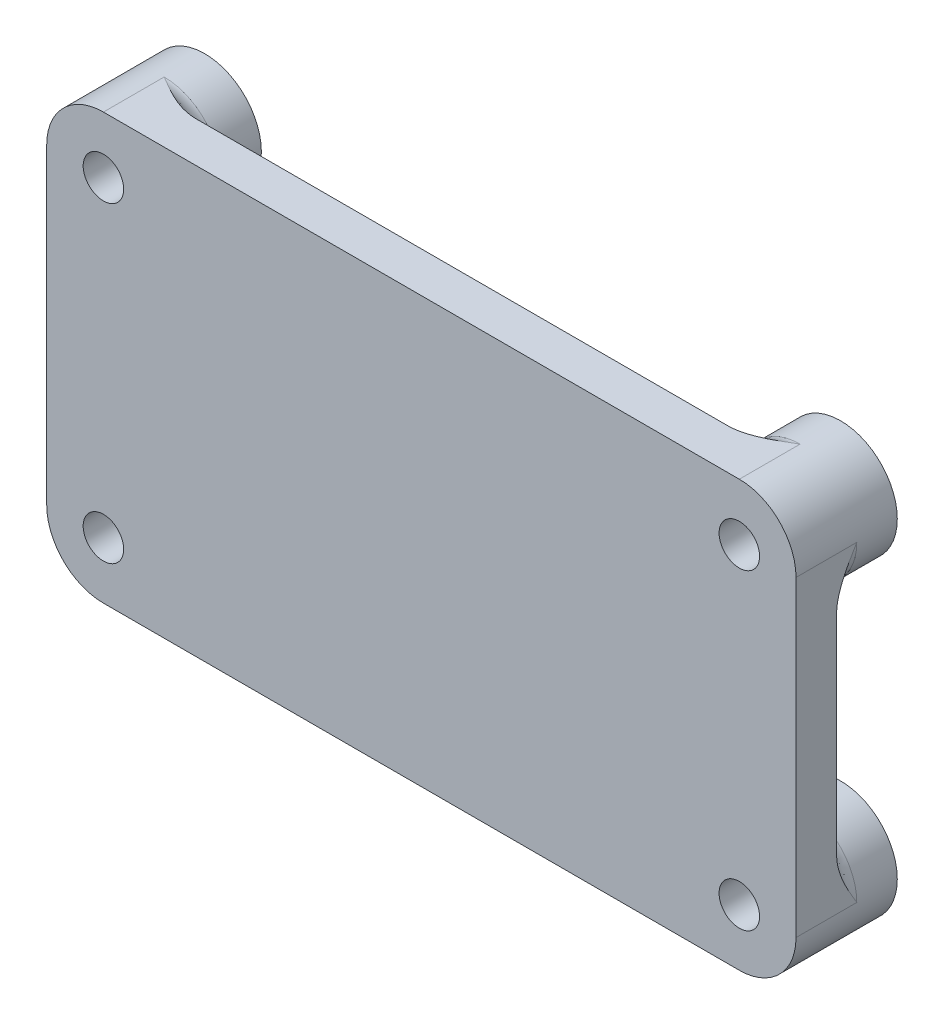
ISO-10303-21;
HEADER;
FILE_DESCRIPTION(('STEP AP214'),'2;1');
FILE_NAME('part.step','',(''),(''),'','','');
FILE_SCHEMA(('AUTOMOTIVE_DESIGN { 1 0 10303 214 1 1 1 1 }'));
ENDSEC;
DATA;
#1=APPLICATION_CONTEXT('core data for automotive mechanical design processes');
#2=APPLICATION_PROTOCOL_DEFINITION('international standard','automotive_design',2000,#1);
#3=PRODUCT_CONTEXT('',#1,'mechanical');
#4=PRODUCT('Part','Part','',(#3));
#5=PRODUCT_RELATED_PRODUCT_CATEGORY('part','',(#4));
#6=PRODUCT_DEFINITION_FORMATION('','',#4);
#7=PRODUCT_DEFINITION_CONTEXT('part definition',#1,'design');
#8=PRODUCT_DEFINITION('design','',#6,#7);
#9=PRODUCT_DEFINITION_SHAPE('','',#8);
#10=(LENGTH_UNIT() NAMED_UNIT(*) SI_UNIT(.MILLI.,.METRE.));
#11=(NAMED_UNIT(*) PLANE_ANGLE_UNIT() SI_UNIT($,.RADIAN.));
#12=(NAMED_UNIT(*) SI_UNIT($,.STERADIAN.) SOLID_ANGLE_UNIT());
#13=UNCERTAINTY_MEASURE_WITH_UNIT(LENGTH_MEASURE(1.E-05),#10,'distance_accuracy_value','');
#14=(GEOMETRIC_REPRESENTATION_CONTEXT(3) GLOBAL_UNCERTAINTY_ASSIGNED_CONTEXT((#13)) GLOBAL_UNIT_ASSIGNED_CONTEXT((#10,
#11,#12)) REPRESENTATION_CONTEXT('',''));
#15=CARTESIAN_POINT('',(0.,0.,0.));
#16=DIRECTION('',(0.,0.,1.));
#17=DIRECTION('',(1.,0.,0.));
#18=AXIS2_PLACEMENT_3D('',#15,#16,#17);
#19=CARTESIAN_POINT('',(0.,10.5,-2.));
#20=DIRECTION('',(0.,-1.,0.));
#21=DIRECTION('',(0.,0.,-1.));
#22=AXIS2_PLACEMENT_3D('',#19,#20,#21);
#23=PLANE('',#22);
#24=DIRECTION('',(1.,0.,0.));
#25=VECTOR('',#24,1.);
#26=CARTESIAN_POINT('',(0.,10.5,0.));
#27=LINE('',#26,#25);
#28=CARTESIAN_POINT('',(-15.7,10.5,0.));
#29=VERTEX_POINT('',#28);
#30=CARTESIAN_POINT('',(15.7,10.5,0.));
#31=VERTEX_POINT('',#30);
#32=EDGE_CURVE('E206',#29,#31,#27,.T.);
#33=ORIENTED_EDGE('',*,*,#32,.T.);
#34=DIRECTION('',(0.,0.,1.));
#35=VECTOR('',#34,1.);
#36=CARTESIAN_POINT('',(15.7,10.5,-2.));
#37=LINE('',#36,#35);
#38=CARTESIAN_POINT('',(15.7,10.5,-3.));
#39=VERTEX_POINT('',#38);
#40=EDGE_CURVE('E65',#39,#31,#37,.T.);
#41=ORIENTED_EDGE('',*,*,#40,.F.);
#42=CARTESIAN_POINT('',(13.130953484267,10.5,-2.));
#43=CARTESIAN_POINT('',(13.2033392447506,10.5,-2.00001618546836));
#44=CARTESIAN_POINT('',(13.2756286815455,10.5,-2.00358851348212));
#45=CARTESIAN_POINT('',(13.4194883975998,10.5,-2.01695300590156));
#46=CARTESIAN_POINT('',(13.4910598736869,10.5,-2.02673201179053));
#47=CARTESIAN_POINT('',(13.7022101236231,10.5,-2.06369339812264));
#48=CARTESIAN_POINT('',(13.8404404400351,10.5,-2.09855656102878));
#49=CARTESIAN_POINT('',(14.12831240532,10.5,-2.18848255328066));
#50=CARTESIAN_POINT('',(14.2773210222677,10.5,-2.24547373680599));
#51=CARTESIAN_POINT('',(14.5698067464413,10.5,-2.37236776192104));
#52=CARTESIAN_POINT('',(14.7132763000383,10.5,-2.44228753123555));
#53=CARTESIAN_POINT('',(15.1392546910789,10.5,-2.66496210023395));
#54=CARTESIAN_POINT('',(15.415232330661,10.5000000000001,-2.8298195356163));
#55=CARTESIAN_POINT('',(15.6939437574616,10.5,-2.99638072182871));
#56=CARTESIAN_POINT('',(15.696971890941,10.5,-2.99819037801799));
#57=CARTESIAN_POINT('',(15.7,10.5,-3.));
#58=B_SPLINE_CURVE_WITH_KNOTS('',3,(#42,#43,#44,#45,#46,#47,#48,#49,#50,#51,#52,#53,#54,#55,#56,
#57),.UNSPECIFIED.,.F.,.F.,(4,2,2,2,2,2,2,4),(0.,0.216924746796609,0.433391129766204,
0.859750227296942,1.33750425415609,1.81588830375774,2.77936074055136,2.78994374579578),.UNSPECIFIED.);
#59=CARTESIAN_POINT('',(13.130953484267,10.5,-2.));
#60=VERTEX_POINT('',#59);
#61=EDGE_CURVE('E11',#39,#60,#58,.F.);
#62=ORIENTED_EDGE('',*,*,#61,.T.);
#63=DIRECTION('',(1.,0.,0.));
#64=VECTOR('',#63,1.);
#65=CARTESIAN_POINT('',(0.,10.5,-2.));
#66=LINE('',#65,#64);
#67=CARTESIAN_POINT('',(-13.130953484267,10.5,-2.));
#68=VERTEX_POINT('',#67);
#69=EDGE_CURVE('E212',#68,#60,#66,.T.);
#70=ORIENTED_EDGE('',*,*,#69,.F.);
#71=CARTESIAN_POINT('',(-13.130953484267,10.5,-2.));
#72=CARTESIAN_POINT('',(-13.2033392447508,10.5,-2.00001618546836));
#73=CARTESIAN_POINT('',(-13.2756286815458,10.5,-2.00358851348213));
#74=CARTESIAN_POINT('',(-13.4194883976003,10.5,-2.01695300590163));
#75=CARTESIAN_POINT('',(-13.4910598736876,10.5,-2.02673201179064));
#76=CARTESIAN_POINT('',(-13.7022101236236,10.5,-2.06369339812277));
#77=CARTESIAN_POINT('',(-13.8404404400354,10.5,-2.09855656102882));
#78=CARTESIAN_POINT('',(-14.1283124053199,10.5,-2.18848255328069));
#79=CARTESIAN_POINT('',(-14.2773210222675,10.5,-2.24547373680615));
#80=CARTESIAN_POINT('',(-14.5698067464411,10.5,-2.37236776192073));
#81=CARTESIAN_POINT('',(-14.7132763000383,10.5,-2.44228753123465));
#82=CARTESIAN_POINT('',(-15.1392546910778,10.5,-2.66496210023522));
#83=CARTESIAN_POINT('',(-15.4152323306561,10.5000000000001,-2.82981953562417));
#84=CARTESIAN_POINT('',(-15.6939437574615,10.5,-2.99638072182889));
#85=CARTESIAN_POINT('',(-15.696971890941,10.5,-2.99819037801807));
#86=CARTESIAN_POINT('',(-15.7,10.5,-3.));
#87=B_SPLINE_CURVE_WITH_KNOTS('',3,(#71,#72,#73,#74,#75,#76,#77,#78,#79,#80,#81,#82,#83,#84,#85,
#86),.UNSPECIFIED.,.F.,.F.,(4,2,2,2,2,2,2,4),(0.,0.216924746797071,0.433391129767027,
0.85975022729694,1.33750425415596,1.8158883037572,2.77936074055137,2.78994374579578),.UNSPECIFIED.);
#88=CARTESIAN_POINT('',(-15.7,10.5,-3.));
#89=VERTEX_POINT('',#88);
#90=EDGE_CURVE('E281',#68,#89,#87,.T.);
#91=ORIENTED_EDGE('',*,*,#90,.T.);
#92=DIRECTION('',(0.,0.,1.));
#93=VECTOR('',#92,1.);
#94=CARTESIAN_POINT('',(-15.7,10.5,-2.));
#95=LINE('',#94,#93);
#96=EDGE_CURVE('E219',#89,#29,#95,.T.);
#97=ORIENTED_EDGE('',*,*,#96,.T.);
#98=EDGE_LOOP('',(#33,#41,#62,#70,#91,#97));
#99=FACE_BOUND('',#98,.T.);
#100=ADVANCED_FACE('F38',(#99),#23,.F.);
#101=CARTESIAN_POINT('',(18.5,0.,-2.));
#102=DIRECTION('',(-1.,0.,0.));
#103=DIRECTION('',(0.,0.,1.));
#104=AXIS2_PLACEMENT_3D('',#101,#102,#103);
#105=PLANE('',#104);
#106=DIRECTION('',(0.,-1.,0.));
#107=VECTOR('',#106,1.);
#108=CARTESIAN_POINT('',(18.5,0.,0.));
#109=LINE('',#108,#107);
#110=CARTESIAN_POINT('',(18.5,7.7,0.));
#111=VERTEX_POINT('',#110);
#112=CARTESIAN_POINT('',(18.5,-7.7,0.));
#113=VERTEX_POINT('',#112);
#114=EDGE_CURVE('E216',#111,#113,#109,.T.);
#115=ORIENTED_EDGE('',*,*,#114,.T.);
#116=DIRECTION('',(0.,0.,1.));
#117=VECTOR('',#116,1.);
#118=CARTESIAN_POINT('',(18.5,-7.7,-2.));
#119=LINE('',#118,#117);
#120=CARTESIAN_POINT('',(18.5,-7.7,-3.));
#121=VERTEX_POINT('',#120);
#122=EDGE_CURVE('E224',#121,#113,#119,.T.);
#123=ORIENTED_EDGE('',*,*,#122,.F.);
#124=CARTESIAN_POINT('',(18.5,-5.13095348426697,-2.));
#125=CARTESIAN_POINT('',(18.5,-5.20333924475109,-2.00001618546835));
#126=CARTESIAN_POINT('',(18.5,-5.27562868154643,-2.00358851348216));
#127=CARTESIAN_POINT('',(18.5,-5.41948839760155,-2.01695300590178));
#128=CARTESIAN_POINT('',(18.5,-5.49105987368908,-2.02673201179086));
#129=CARTESIAN_POINT('',(18.5,-5.70221012362476,-2.06369339812304));
#130=CARTESIAN_POINT('',(18.5,-5.840440440036,-2.0985565610289));
#131=CARTESIAN_POINT('',(18.5,-6.12831240531974,-2.18848255328077));
#132=CARTESIAN_POINT('',(18.5,-6.27732102226707,-2.24547373680648));
#133=CARTESIAN_POINT('',(18.5,-6.56980674644084,-2.37236776192009));
#134=CARTESIAN_POINT('',(18.5,-6.71327630003846,-2.44228753123275));
#135=CARTESIAN_POINT('',(18.5,-7.13925469107526,-2.66496210023788));
#136=CARTESIAN_POINT('',(18.5,-7.41523233064574,-2.82981953564077));
#137=CARTESIAN_POINT('',(18.5,-7.69394375746128,-2.99638072182925));
#138=CARTESIAN_POINT('',(18.5,-7.69697189094087,-2.99819037801826));
#139=CARTESIAN_POINT('',(18.5,-7.7,-3.));
#140=B_SPLINE_CURVE_WITH_KNOTS('',3,(#124,#125,#126,#127,#128,#129,#130,#131,#132,#133,#134,
#135,#136,#137,#138,#139),.UNSPECIFIED.,.F.,.F.,(4,2,2,2,2,2,2,4),(0.,0.21692474679805,
0.433391129768769,0.859750227296941,1.33750425415567,1.81588830375606,2.77936074055135,
2.78994374579577),.UNSPECIFIED.);
#141=CARTESIAN_POINT('',(18.5,-5.13095348426697,-2.));
#142=VERTEX_POINT('',#141);
#143=EDGE_CURVE('E303',#121,#142,#140,.F.);
#144=ORIENTED_EDGE('',*,*,#143,.T.);
#145=DIRECTION('',(0.,-1.,0.));
#146=VECTOR('',#145,1.);
#147=CARTESIAN_POINT('',(18.5,0.,-2.));
#148=LINE('',#147,#146);
#149=CARTESIAN_POINT('',(18.5,5.13095348426697,-2.));
#150=VERTEX_POINT('',#149);
#151=EDGE_CURVE('E209',#150,#142,#148,.T.);
#152=ORIENTED_EDGE('',*,*,#151,.F.);
#153=CARTESIAN_POINT('',(18.5,5.13095348426697,-2.));
#154=CARTESIAN_POINT('',(18.5,5.20333924475109,-2.00001618546835));
#155=CARTESIAN_POINT('',(18.5,5.27562868154643,-2.00358851348216));
#156=CARTESIAN_POINT('',(18.5,5.41948839760155,-2.01695300590178));
#157=CARTESIAN_POINT('',(18.5,5.49105987368907,-2.02673201179086));
#158=CARTESIAN_POINT('',(18.5,5.70221012362476,-2.06369339812304));
#159=CARTESIAN_POINT('',(18.5,5.84044044003599,-2.0985565610289));
#160=CARTESIAN_POINT('',(18.5,6.12831240531974,-2.18848255328077));
#161=CARTESIAN_POINT('',(18.5,6.27732102226707,-2.24547373680648));
#162=CARTESIAN_POINT('',(18.5,6.56980674644084,-2.37236776192009));
#163=CARTESIAN_POINT('',(18.5,6.71327630003845,-2.44228753123275));
#164=CARTESIAN_POINT('',(18.5,7.13925469107526,-2.66496210023788));
#165=CARTESIAN_POINT('',(18.5,7.41523233064574,-2.82981953564077));
#166=CARTESIAN_POINT('',(18.5,7.69394375746127,-2.99638072182925));
#167=CARTESIAN_POINT('',(18.5,7.69697189094087,-2.99819037801826));
#168=CARTESIAN_POINT('',(18.5,7.7,-3.));
#169=B_SPLINE_CURVE_WITH_KNOTS('',3,(#153,#154,#155,#156,#157,#158,#159,#160,#161,#162,#163,
#164,#165,#166,#167,#168),.UNSPECIFIED.,.F.,.F.,(4,2,2,2,2,2,2,4),(0.,0.21692474679805,
0.433391129768769,0.859750227296941,1.33750425415567,1.81588830375606,2.77936074055135,
2.78994374579577),.UNSPECIFIED.);
#170=CARTESIAN_POINT('',(18.5,7.7,-3.));
#171=VERTEX_POINT('',#170);
#172=EDGE_CURVE('E51',#150,#171,#169,.T.);
#173=ORIENTED_EDGE('',*,*,#172,.T.);
#174=DIRECTION('',(0.,0.,1.));
#175=VECTOR('',#174,1.);
#176=CARTESIAN_POINT('',(18.5,7.7,-2.));
#177=LINE('',#176,#175);
#178=EDGE_CURVE('E58',#171,#111,#177,.T.);
#179=ORIENTED_EDGE('',*,*,#178,.T.);
#180=EDGE_LOOP('',(#115,#123,#144,#152,#173,#179));
#181=FACE_BOUND('',#180,.T.);
#182=ADVANCED_FACE('F307',(#181),#105,.F.);
#183=CARTESIAN_POINT('',(0.,-10.5,-2.));
#184=DIRECTION('',(0.,-1.,0.));
#185=DIRECTION('',(1.,0.,0.));
#186=AXIS2_PLACEMENT_3D('',#183,#184,#185);
#187=PLANE('',#186);
#188=DIRECTION('',(1.,0.,0.));
#189=VECTOR('',#188,1.);
#190=CARTESIAN_POINT('',(0.,-10.5,0.));
#191=LINE('',#190,#189);
#192=CARTESIAN_POINT('',(-15.7,-10.5,0.));
#193=VERTEX_POINT('',#192);
#194=CARTESIAN_POINT('',(15.7,-10.5,0.));
#195=VERTEX_POINT('',#194);
#196=EDGE_CURVE('E143',#193,#195,#191,.T.);
#197=ORIENTED_EDGE('',*,*,#196,.F.);
#198=DIRECTION('',(0.,0.,1.));
#199=VECTOR('',#198,1.);
#200=CARTESIAN_POINT('',(-15.7,-10.5,-2.));
#201=LINE('',#200,#199);
#202=CARTESIAN_POINT('',(-15.7,-10.5,-3.));
#203=VERTEX_POINT('',#202);
#204=EDGE_CURVE('E154',#203,#193,#201,.T.);
#205=ORIENTED_EDGE('',*,*,#204,.F.);
#206=CARTESIAN_POINT('',(-13.130953484267,-10.5,-2.));
#207=CARTESIAN_POINT('',(-13.2033392447509,-10.5,-2.00001618546835));
#208=CARTESIAN_POINT('',(-13.2756286815461,-10.5,-2.00358851348214));
#209=CARTESIAN_POINT('',(-13.4194883976009,-10.5,-2.0169530059017));
#210=CARTESIAN_POINT('',(-13.4910598736883,-10.5,-2.02673201179075));
#211=CARTESIAN_POINT('',(-13.7022101236242,-10.5,-2.0636933981229));
#212=CARTESIAN_POINT('',(-13.8404404400357,-10.5,-2.09855656102886));
#213=CARTESIAN_POINT('',(-14.1283124053198,-10.5,-2.18848255328073));
#214=CARTESIAN_POINT('',(-14.2773210222673,-10.5,-2.24547373680631));
#215=CARTESIAN_POINT('',(-14.569806746441,-10.5,-2.37236776192043));
#216=CARTESIAN_POINT('',(-14.7132763000384,-10.5,-2.44228753123373));
#217=CARTESIAN_POINT('',(-15.1392546910766,-10.5,-2.66496210023651));
#218=CARTESIAN_POINT('',(-15.4152323306511,-10.5,-2.82981953563221));
#219=CARTESIAN_POINT('',(-15.6939437574614,-10.5,-2.99638072182907));
#220=CARTESIAN_POINT('',(-15.6969718909409,-10.5,-2.99819037801817));
#221=CARTESIAN_POINT('',(-15.7,-10.5,-3.));
#222=B_SPLINE_CURVE_WITH_KNOTS('',3,(#206,#207,#208,#209,#210,#211,#212,#213,#214,#215,#216,
#217,#218,#219,#220,#221),.UNSPECIFIED.,.F.,.F.,(4,2,2,2,2,2,2,4),(0.,0.216924746797547,
0.433391129767872,0.859750227296941,1.33750425415583,1.81588830375666,2.77936074055137,
2.78994374579577),.UNSPECIFIED.);
#223=CARTESIAN_POINT('',(-13.130953484267,-10.5,-2.));
#224=VERTEX_POINT('',#223);
#225=EDGE_CURVE('E259',#203,#224,#222,.F.);
#226=ORIENTED_EDGE('',*,*,#225,.T.);
#227=DIRECTION('',(1.,0.,0.));
#228=VECTOR('',#227,1.);
#229=CARTESIAN_POINT('',(0.,-10.5,-2.));
#230=LINE('',#229,#228);
#231=CARTESIAN_POINT('',(13.130953484267,-10.5,-2.));
#232=VERTEX_POINT('',#231);
#233=EDGE_CURVE('E205',#224,#232,#230,.T.);
#234=ORIENTED_EDGE('',*,*,#233,.T.);
#235=CARTESIAN_POINT('',(13.130953484267,-10.5,-2.));
#236=CARTESIAN_POINT('',(13.2033392447511,-10.5,-2.00001618546835));
#237=CARTESIAN_POINT('',(13.2756286815464,-10.5,-2.00358851348216));
#238=CARTESIAN_POINT('',(13.4194883976014,-10.5,-2.01695300590176));
#239=CARTESIAN_POINT('',(13.4910598736889,-10.5,-2.02673201179084));
#240=CARTESIAN_POINT('',(13.7022101236246,-10.5,-2.06369339812301));
#241=CARTESIAN_POINT('',(13.8404404400359,-10.5,-2.09855656102889));
#242=CARTESIAN_POINT('',(14.1283124053198,-10.5,-2.18848255328076));
#243=CARTESIAN_POINT('',(14.2773210222671,-10.5,-2.24547373680645));
#244=CARTESIAN_POINT('',(14.5698067464409,-10.5,-2.37236776192016));
#245=CARTESIAN_POINT('',(14.7132763000384,-10.5,-2.44228753123293));
#246=CARTESIAN_POINT('',(15.1392546910755,-10.5,-2.66496210023764));
#247=CARTESIAN_POINT('',(15.4152323306467,-10.4999999999999,-2.82981953563921));
#248=CARTESIAN_POINT('',(15.6939437574613,-10.5,-2.99638072182923));
#249=CARTESIAN_POINT('',(15.6969718909409,-10.5,-2.99819037801824));
#250=CARTESIAN_POINT('',(15.7,-10.5,-3.));
#251=B_SPLINE_CURVE_WITH_KNOTS('',3,(#235,#236,#237,#238,#239,#240,#241,#242,#243,#244,#245,
#246,#247,#248,#249,#250),.UNSPECIFIED.,.F.,.F.,(4,2,2,2,2,2,2,4),(0.,0.216924746797957,
0.433391129768604,0.85975022729694,1.3375042541557,1.81588830375617,2.77936074055137,
2.78994374579577),.UNSPECIFIED.);
#252=CARTESIAN_POINT('',(15.7,-10.5,-3.));
#253=VERTEX_POINT('',#252);
#254=EDGE_CURVE('E299',#232,#253,#251,.T.);
#255=ORIENTED_EDGE('',*,*,#254,.T.);
#256=DIRECTION('',(0.,0.,1.));
#257=VECTOR('',#256,1.);
#258=CARTESIAN_POINT('',(15.7,-10.5,-2.));
#259=LINE('',#258,#257);
#260=EDGE_CURVE('E227',#253,#195,#259,.T.);
#261=ORIENTED_EDGE('',*,*,#260,.T.);
#262=EDGE_LOOP('',(#197,#205,#226,#234,#255,#261));
#263=FACE_BOUND('',#262,.T.);
#264=ADVANCED_FACE('F271',(#263),#187,.T.);
#265=CARTESIAN_POINT('',(-18.5,0.,-2.));
#266=DIRECTION('',(-1.,0.,0.));
#267=DIRECTION('',(0.,0.,1.));
#268=AXIS2_PLACEMENT_3D('',#265,#266,#267);
#269=PLANE('',#268);
#270=DIRECTION('',(0.,-1.,0.));
#271=VECTOR('',#270,1.);
#272=CARTESIAN_POINT('',(-18.5,0.,0.));
#273=LINE('',#272,#271);
#274=CARTESIAN_POINT('',(-18.5,7.7,0.));
#275=VERTEX_POINT('',#274);
#276=CARTESIAN_POINT('',(-18.5,-7.7,0.));
#277=VERTEX_POINT('',#276);
#278=EDGE_CURVE('E132',#275,#277,#273,.T.);
#279=ORIENTED_EDGE('',*,*,#278,.F.);
#280=DIRECTION('',(0.,0.,1.));
#281=VECTOR('',#280,1.);
#282=CARTESIAN_POINT('',(-18.5,7.7,-2.));
#283=LINE('',#282,#281);
#284=CARTESIAN_POINT('',(-18.5,7.7,-3.));
#285=VERTEX_POINT('',#284);
#286=EDGE_CURVE('E155',#285,#275,#283,.T.);
#287=ORIENTED_EDGE('',*,*,#286,.F.);
#288=CARTESIAN_POINT('',(-18.5,5.13095348426697,-2.));
#289=CARTESIAN_POINT('',(-18.5,5.20333924475092,-2.00001618546835));
#290=CARTESIAN_POINT('',(-18.5,5.27562868154609,-2.00358851348214));
#291=CARTESIAN_POINT('',(-18.5,5.41948839760092,-2.0169530059017));
#292=CARTESIAN_POINT('',(-18.5,5.49105987368832,-2.02673201179075));
#293=CARTESIAN_POINT('',(-18.5,5.70221012362417,-2.0636933981229));
#294=CARTESIAN_POINT('',(-18.5,5.84044044003569,-2.09855656102886));
#295=CARTESIAN_POINT('',(-18.5,6.12831240531982,-2.18848255328073));
#296=CARTESIAN_POINT('',(-18.5,6.27732102226729,-2.24547373680631));
#297=CARTESIAN_POINT('',(-18.5,6.56980674644099,-2.37236776192042));
#298=CARTESIAN_POINT('',(-18.5,6.71327630003839,-2.44228753123373));
#299=CARTESIAN_POINT('',(-18.5,7.13925469107655,-2.66496210023652));
#300=CARTESIAN_POINT('',(-18.5,7.41523233065107,-2.82981953563226));
#301=CARTESIAN_POINT('',(-18.5,7.6939437574614,-2.99638072182907));
#302=CARTESIAN_POINT('',(-18.5,7.69697189094093,-2.99819037801817));
#303=CARTESIAN_POINT('',(-18.5,7.7,-3.));
#304=B_SPLINE_CURVE_WITH_KNOTS('',3,(#288,#289,#290,#291,#292,#293,#294,#295,#296,#297,#298,
#299,#300,#301,#302,#303),.UNSPECIFIED.,.F.,.F.,(4,2,2,2,2,2,2,4),(0.,0.216924746797547,
0.433391129767876,0.859750227296942,1.33750425415582,1.81588830375665,2.77936074055137,
2.78994374579577),.UNSPECIFIED.);
#305=CARTESIAN_POINT('',(-18.5,5.13095348426697,-2.));
#306=VERTEX_POINT('',#305);
#307=EDGE_CURVE('E276',#285,#306,#304,.F.);
#308=ORIENTED_EDGE('',*,*,#307,.T.);
#309=DIRECTION('',(0.,-1.,0.));
#310=VECTOR('',#309,1.);
#311=CARTESIAN_POINT('',(-18.5,0.,-2.));
#312=LINE('',#311,#310);
#313=CARTESIAN_POINT('',(-18.5,-5.13095348426698,-2.));
#314=VERTEX_POINT('',#313);
#315=EDGE_CURVE('E203',#306,#314,#312,.T.);
#316=ORIENTED_EDGE('',*,*,#315,.T.);
#317=CARTESIAN_POINT('',(-18.5,-5.13095348426698,-2.));
#318=CARTESIAN_POINT('',(-18.5,-5.20333924475092,-2.00001618546835));
#319=CARTESIAN_POINT('',(-18.5,-5.2756286815461,-2.00358851348214));
#320=CARTESIAN_POINT('',(-18.5,-5.41948839760093,-2.0169530059017));
#321=CARTESIAN_POINT('',(-18.5,-5.49105987368833,-2.02673201179075));
#322=CARTESIAN_POINT('',(-18.5,-5.70221012362418,-2.0636933981229));
#323=CARTESIAN_POINT('',(-18.5,-5.84044044003569,-2.09855656102886));
#324=CARTESIAN_POINT('',(-18.5,-6.12831240531982,-2.18848255328073));
#325=CARTESIAN_POINT('',(-18.5,-6.27732102226729,-2.24547373680631));
#326=CARTESIAN_POINT('',(-18.5,-6.56980674644099,-2.37236776192042));
#327=CARTESIAN_POINT('',(-18.5,-6.7132763000384,-2.44228753123373));
#328=CARTESIAN_POINT('',(-18.5,-7.13925469107655,-2.66496210023652));
#329=CARTESIAN_POINT('',(-18.5,-7.41523233065107,-2.82981953563226));
#330=CARTESIAN_POINT('',(-18.5,-7.6939437574614,-2.99638072182907));
#331=CARTESIAN_POINT('',(-18.5,-7.69697189094093,-2.99819037801817));
#332=CARTESIAN_POINT('',(-18.5,-7.7,-3.));
#333=B_SPLINE_CURVE_WITH_KNOTS('',3,(#317,#318,#319,#320,#321,#322,#323,#324,#325,#326,#327,
#328,#329,#330,#331,#332),.UNSPECIFIED.,.F.,.F.,(4,2,2,2,2,2,2,4),(0.,0.216924746797549,
0.433391129767876,0.859750227296942,1.33750425415582,1.81588830375665,2.77936074055137,
2.78994374579577),.UNSPECIFIED.);
#334=CARTESIAN_POINT('',(-18.5,-7.7,-3.));
#335=VERTEX_POINT('',#334);
#336=EDGE_CURVE('E150',#314,#335,#333,.T.);
#337=ORIENTED_EDGE('',*,*,#336,.T.);
#338=DIRECTION('',(0.,0.,1.));
#339=VECTOR('',#338,1.);
#340=CARTESIAN_POINT('',(-18.5,-7.7,-2.));
#341=LINE('',#340,#339);
#342=EDGE_CURVE('E147',#335,#277,#341,.T.);
#343=ORIENTED_EDGE('',*,*,#342,.T.);
#344=EDGE_LOOP('',(#279,#287,#308,#316,#337,#343));
#345=FACE_BOUND('',#344,.T.);
#346=ADVANCED_FACE('F148',(#345),#269,.T.);
#347=CARTESIAN_POINT('',(0.,0.,-2.));
#348=DIRECTION('',(0.,0.,1.));
#349=DIRECTION('',(1.,0.,0.));
#350=AXIS2_PLACEMENT_3D('',#347,#348,#349);
#351=PLANE('',#350);
#352=ORIENTED_EDGE('',*,*,#233,.F.);
#353=CARTESIAN_POINT('',(-15.7,-7.7,-2.));
#354=DIRECTION('',(0.,0.,1.));
#355=DIRECTION('',(1.,0.,0.));
#356=AXIS2_PLACEMENT_3D('',#353,#354,#355);
#357=CIRCLE('',#356,3.8);
#358=EDGE_CURVE('E240',#224,#314,#357,.T.);
#359=ORIENTED_EDGE('',*,*,#358,.T.);
#360=ORIENTED_EDGE('',*,*,#315,.F.);
#361=CARTESIAN_POINT('',(-15.7,7.7,-2.));
#362=DIRECTION('',(0.,0.,1.));
#363=DIRECTION('',(1.,0.,0.));
#364=AXIS2_PLACEMENT_3D('',#361,#362,#363);
#365=CIRCLE('',#364,3.8);
#366=EDGE_CURVE('E234',#306,#68,#365,.T.);
#367=ORIENTED_EDGE('',*,*,#366,.T.);
#368=ORIENTED_EDGE('',*,*,#69,.T.);
#369=CARTESIAN_POINT('',(15.7,7.7,-2.));
#370=DIRECTION('',(0.,0.,1.));
#371=DIRECTION('',(1.,0.,0.));
#372=AXIS2_PLACEMENT_3D('',#369,#370,#371);
#373=CIRCLE('',#372,3.8);
#374=EDGE_CURVE('E221',#60,#150,#373,.T.);
#375=ORIENTED_EDGE('',*,*,#374,.T.);
#376=ORIENTED_EDGE('',*,*,#151,.T.);
#377=CARTESIAN_POINT('',(15.7,-7.7,-2.));
#378=DIRECTION('',(0.,0.,1.));
#379=DIRECTION('',(1.,0.,0.));
#380=AXIS2_PLACEMENT_3D('',#377,#378,#379);
#381=CIRCLE('',#380,3.8);
#382=EDGE_CURVE('E237',#142,#232,#381,.T.);
#383=ORIENTED_EDGE('',*,*,#382,.T.);
#384=EDGE_LOOP('',(#352,#359,#360,#367,#368,#375,#376,#383));
#385=FACE_BOUND('',#384,.T.);
#386=ADVANCED_FACE('F270',(#385),#351,.F.);
#387=CARTESIAN_POINT('',(0.,0.,0.));
#388=DIRECTION('',(0.,0.,1.));
#389=DIRECTION('',(1.,0.,0.));
#390=AXIS2_PLACEMENT_3D('',#387,#388,#389);
#391=PLANE('',#390);
#392=ORIENTED_EDGE('',*,*,#32,.F.);
#393=CARTESIAN_POINT('',(-15.7,7.7,0.));
#394=DIRECTION('',(0.,0.,1.));
#395=DIRECTION('',(1.,0.,0.));
#396=AXIS2_PLACEMENT_3D('',#393,#394,#395);
#397=CIRCLE('',#396,2.8);
#398=EDGE_CURVE('E140',#29,#275,#397,.T.);
#399=ORIENTED_EDGE('',*,*,#398,.T.);
#400=ORIENTED_EDGE('',*,*,#278,.T.);
#401=CARTESIAN_POINT('',(-15.7,-7.7,0.));
#402=DIRECTION('',(0.,0.,1.));
#403=DIRECTION('',(1.,0.,0.));
#404=AXIS2_PLACEMENT_3D('',#401,#402,#403);
#405=CIRCLE('',#404,2.8);
#406=EDGE_CURVE('E138',#277,#193,#405,.T.);
#407=ORIENTED_EDGE('',*,*,#406,.T.);
#408=ORIENTED_EDGE('',*,*,#196,.T.);
#409=CARTESIAN_POINT('',(15.7,-7.7,0.));
#410=DIRECTION('',(0.,0.,1.));
#411=DIRECTION('',(1.,0.,0.));
#412=AXIS2_PLACEMENT_3D('',#409,#410,#411);
#413=CIRCLE('',#412,2.8);
#414=EDGE_CURVE('E174',#195,#113,#413,.T.);
#415=ORIENTED_EDGE('',*,*,#414,.T.);
#416=ORIENTED_EDGE('',*,*,#114,.F.);
#417=CARTESIAN_POINT('',(15.7,7.7,0.));
#418=DIRECTION('',(0.,0.,1.));
#419=DIRECTION('',(1.,0.,0.));
#420=AXIS2_PLACEMENT_3D('',#417,#418,#419);
#421=CIRCLE('',#420,2.8);
#422=EDGE_CURVE('E187',#111,#31,#421,.T.);
#423=ORIENTED_EDGE('',*,*,#422,.T.);
#424=EDGE_LOOP('',(#392,#399,#400,#407,#408,#415,#416,#423));
#425=FACE_BOUND('',#424,.T.);
#426=CARTESIAN_POINT('',(-15.7,7.7,0.));
#427=DIRECTION('',(0.,0.,1.));
#428=DIRECTION('',(1.,0.,0.));
#429=AXIS2_PLACEMENT_3D('',#426,#427,#428);
#430=CIRCLE('',#429,1.);
#431=CARTESIAN_POINT('',(-14.7,7.7,0.));
#432=VERTEX_POINT('',#431);
#433=EDGE_CURVE('E190',#432,#432,#430,.T.);
#434=ORIENTED_EDGE('',*,*,#433,.F.);
#435=EDGE_LOOP('',(#434));
#436=FACE_BOUND('',#435,.T.);
#437=CARTESIAN_POINT('',(15.7,7.7,0.));
#438=DIRECTION('',(0.,0.,1.));
#439=DIRECTION('',(1.,0.,0.));
#440=AXIS2_PLACEMENT_3D('',#437,#438,#439);
#441=CIRCLE('',#440,1.);
#442=CARTESIAN_POINT('',(16.7,7.7,0.));
#443=VERTEX_POINT('',#442);
#444=EDGE_CURVE('E177',#443,#443,#441,.T.);
#445=ORIENTED_EDGE('',*,*,#444,.F.);
#446=EDGE_LOOP('',(#445));
#447=FACE_BOUND('',#446,.T.);
#448=CARTESIAN_POINT('',(15.7,-7.7,0.));
#449=DIRECTION('',(0.,0.,1.));
#450=DIRECTION('',(1.,0.,0.));
#451=AXIS2_PLACEMENT_3D('',#448,#449,#450);
#452=CIRCLE('',#451,1.);
#453=CARTESIAN_POINT('',(16.7,-7.7,0.));
#454=VERTEX_POINT('',#453);
#455=EDGE_CURVE('E178',#454,#454,#452,.T.);
#456=ORIENTED_EDGE('',*,*,#455,.F.);
#457=EDGE_LOOP('',(#456));
#458=FACE_BOUND('',#457,.T.);
#459=CARTESIAN_POINT('',(-15.7,-7.7,0.));
#460=DIRECTION('',(0.,0.,1.));
#461=DIRECTION('',(1.,0.,0.));
#462=AXIS2_PLACEMENT_3D('',#459,#460,#461);
#463=CIRCLE('',#462,1.);
#464=CARTESIAN_POINT('',(-14.7,-7.7,0.));
#465=VERTEX_POINT('',#464);
#466=EDGE_CURVE('E161',#465,#465,#463,.T.);
#467=ORIENTED_EDGE('',*,*,#466,.F.);
#468=EDGE_LOOP('',(#467));
#469=FACE_BOUND('',#468,.T.);
#470=ADVANCED_FACE('F135',(#425,#436,#447,#458,#469),#391,.T.);
#471=CARTESIAN_POINT('',(-15.7,7.7,-5.));
#472=DIRECTION('',(0.,0.,1.));
#473=DIRECTION('',(1.,0.,0.));
#474=AXIS2_PLACEMENT_3D('',#471,#472,#473);
#475=CYLINDRICAL_SURFACE('',#474,2.8);
#476=CARTESIAN_POINT('',(-15.7,7.7,-5.));
#477=DIRECTION('',(0.,0.,1.));
#478=DIRECTION('',(1.,0.,0.));
#479=AXIS2_PLACEMENT_3D('',#476,#477,#478);
#480=CIRCLE('',#479,2.8);
#481=CARTESIAN_POINT('',(-12.9,7.7,-5.));
#482=VERTEX_POINT('',#481);
#483=EDGE_CURVE('E144',#482,#482,#480,.T.);
#484=ORIENTED_EDGE('',*,*,#483,.T.);
#485=EDGE_LOOP('',(#484));
#486=FACE_BOUND('',#485,.T.);
#487=ORIENTED_EDGE('',*,*,#96,.F.);
#488=CARTESIAN_POINT('',(-15.7,7.7,-3.));
#489=DIRECTION('',(0.,0.,1.));
#490=DIRECTION('',(1.,0.,0.));
#491=AXIS2_PLACEMENT_3D('',#488,#489,#490);
#492=CIRCLE('',#491,2.8);
#493=EDGE_CURVE('E248',#89,#285,#492,.F.);
#494=ORIENTED_EDGE('',*,*,#493,.T.);
#495=ORIENTED_EDGE('',*,*,#286,.T.);
#496=ORIENTED_EDGE('',*,*,#398,.F.);
#497=EDGE_LOOP('',(#487,#494,#495,#496));
#498=FACE_BOUND('',#497,.T.);
#499=ADVANCED_FACE('F318',(#486,#498),#475,.T.);
#500=CARTESIAN_POINT('',(-15.7,7.7,-5.));
#501=DIRECTION('',(0.,0.,1.));
#502=DIRECTION('',(1.,0.,0.));
#503=AXIS2_PLACEMENT_3D('',#500,#501,#502);
#504=CYLINDRICAL_SURFACE('',#503,1.);
#505=CARTESIAN_POINT('',(-15.7,7.7,-5.));
#506=DIRECTION('',(0.,0.,1.));
#507=DIRECTION('',(1.,0.,0.));
#508=AXIS2_PLACEMENT_3D('',#505,#506,#507);
#509=CIRCLE('',#508,1.);
#510=CARTESIAN_POINT('',(-14.7,7.7,-5.));
#511=VERTEX_POINT('',#510);
#512=EDGE_CURVE('E195',#511,#511,#509,.T.);
#513=ORIENTED_EDGE('',*,*,#512,.F.);
#514=EDGE_LOOP('',(#513));
#515=FACE_BOUND('',#514,.T.);
#516=ORIENTED_EDGE('',*,*,#433,.T.);
#517=EDGE_LOOP('',(#516));
#518=FACE_BOUND('',#517,.T.);
#519=ADVANCED_FACE('F322',(#515,#518),#504,.F.);
#520=CARTESIAN_POINT('',(0.,0.,-5.));
#521=DIRECTION('',(0.,0.,1.));
#522=DIRECTION('',(1.,0.,0.));
#523=AXIS2_PLACEMENT_3D('',#520,#521,#522);
#524=PLANE('',#523);
#525=ORIENTED_EDGE('',*,*,#512,.T.);
#526=EDGE_LOOP('',(#525));
#527=FACE_BOUND('',#526,.T.);
#528=ORIENTED_EDGE('',*,*,#483,.F.);
#529=EDGE_LOOP('',(#528));
#530=FACE_BOUND('',#529,.T.);
#531=ADVANCED_FACE('F325',(#527,#530),#524,.F.);
#532=CARTESIAN_POINT('',(15.7,7.7,-5.));
#533=DIRECTION('',(0.,0.,1.));
#534=DIRECTION('',(1.,0.,0.));
#535=AXIS2_PLACEMENT_3D('',#532,#533,#534);
#536=CYLINDRICAL_SURFACE('',#535,1.);
#537=CARTESIAN_POINT('',(15.7,7.7,-5.));
#538=DIRECTION('',(0.,0.,1.));
#539=DIRECTION('',(1.,0.,0.));
#540=AXIS2_PLACEMENT_3D('',#537,#538,#539);
#541=CIRCLE('',#540,1.);
#542=CARTESIAN_POINT('',(16.7,7.7,-5.));
#543=VERTEX_POINT('',#542);
#544=EDGE_CURVE('E183',#543,#543,#541,.T.);
#545=ORIENTED_EDGE('',*,*,#544,.F.);
#546=EDGE_LOOP('',(#545));
#547=FACE_BOUND('',#546,.T.);
#548=ORIENTED_EDGE('',*,*,#444,.T.);
#549=EDGE_LOOP('',(#548));
#550=FACE_BOUND('',#549,.T.);
#551=ADVANCED_FACE('F332',(#547,#550),#536,.F.);
#552=CARTESIAN_POINT('',(15.7,7.7,-5.));
#553=DIRECTION('',(0.,0.,1.));
#554=DIRECTION('',(1.,0.,0.));
#555=AXIS2_PLACEMENT_3D('',#552,#553,#554);
#556=CYLINDRICAL_SURFACE('',#555,2.8);
#557=ORIENTED_EDGE('',*,*,#178,.F.);
#558=CARTESIAN_POINT('',(15.7,7.7,-3.));
#559=DIRECTION('',(0.,0.,1.));
#560=DIRECTION('',(1.,0.,0.));
#561=AXIS2_PLACEMENT_3D('',#558,#559,#560);
#562=CIRCLE('',#561,2.8);
#563=EDGE_CURVE('E251',#171,#39,#562,.F.);
#564=ORIENTED_EDGE('',*,*,#563,.T.);
#565=ORIENTED_EDGE('',*,*,#40,.T.);
#566=ORIENTED_EDGE('',*,*,#422,.F.);
#567=EDGE_LOOP('',(#557,#564,#565,#566));
#568=FACE_BOUND('',#567,.T.);
#569=CARTESIAN_POINT('',(15.7,7.7,-5.));
#570=DIRECTION('',(0.,0.,1.));
#571=DIRECTION('',(1.,0.,0.));
#572=AXIS2_PLACEMENT_3D('',#569,#570,#571);
#573=CIRCLE('',#572,2.8);
#574=CARTESIAN_POINT('',(18.5,7.7,-5.));
#575=VERTEX_POINT('',#574);
#576=EDGE_CURVE('E186',#575,#575,#573,.T.);
#577=ORIENTED_EDGE('',*,*,#576,.T.);
#578=EDGE_LOOP('',(#577));
#579=FACE_BOUND('',#578,.T.);
#580=ADVANCED_FACE('F336',(#568,#579),#556,.T.);
#581=CARTESIAN_POINT('',(0.,0.,-5.));
#582=DIRECTION('',(0.,0.,1.));
#583=DIRECTION('',(1.,0.,0.));
#584=AXIS2_PLACEMENT_3D('',#581,#582,#583);
#585=PLANE('',#584);
#586=ORIENTED_EDGE('',*,*,#544,.T.);
#587=EDGE_LOOP('',(#586));
#588=FACE_BOUND('',#587,.T.);
#589=ORIENTED_EDGE('',*,*,#576,.F.);
#590=EDGE_LOOP('',(#589));
#591=FACE_BOUND('',#590,.T.);
#592=ADVANCED_FACE('F340',(#588,#591),#585,.F.);
#593=CARTESIAN_POINT('',(15.7,-7.7,-5.));
#594=DIRECTION('',(0.,0.,1.));
#595=DIRECTION('',(1.,0.,0.));
#596=AXIS2_PLACEMENT_3D('',#593,#594,#595);
#597=CYLINDRICAL_SURFACE('',#596,1.);
#598=CARTESIAN_POINT('',(15.7,-7.7,-5.));
#599=DIRECTION('',(0.,0.,1.));
#600=DIRECTION('',(1.,0.,0.));
#601=AXIS2_PLACEMENT_3D('',#598,#599,#600);
#602=CIRCLE('',#601,1.);
#603=CARTESIAN_POINT('',(16.7,-7.7,-5.));
#604=VERTEX_POINT('',#603);
#605=EDGE_CURVE('E170',#604,#604,#602,.T.);
#606=ORIENTED_EDGE('',*,*,#605,.F.);
#607=EDGE_LOOP('',(#606));
#608=FACE_BOUND('',#607,.T.);
#609=ORIENTED_EDGE('',*,*,#455,.T.);
#610=EDGE_LOOP('',(#609));
#611=FACE_BOUND('',#610,.T.);
#612=ADVANCED_FACE('F343',(#608,#611),#597,.F.);
#613=CARTESIAN_POINT('',(15.7,-7.7,-5.));
#614=DIRECTION('',(0.,0.,1.));
#615=DIRECTION('',(1.,0.,0.));
#616=AXIS2_PLACEMENT_3D('',#613,#614,#615);
#617=CYLINDRICAL_SURFACE('',#616,2.8);
#618=ORIENTED_EDGE('',*,*,#260,.F.);
#619=CARTESIAN_POINT('',(15.7,-7.7,-3.));
#620=DIRECTION('',(0.,0.,1.));
#621=DIRECTION('',(1.,0.,0.));
#622=AXIS2_PLACEMENT_3D('',#619,#620,#621);
#623=CIRCLE('',#622,2.8);
#624=EDGE_CURVE('E245',#253,#121,#623,.F.);
#625=ORIENTED_EDGE('',*,*,#624,.T.);
#626=ORIENTED_EDGE('',*,*,#122,.T.);
#627=ORIENTED_EDGE('',*,*,#414,.F.);
#628=EDGE_LOOP('',(#618,#625,#626,#627));
#629=FACE_BOUND('',#628,.T.);
#630=CARTESIAN_POINT('',(15.7,-7.7,-5.));
#631=DIRECTION('',(0.,0.,1.));
#632=DIRECTION('',(1.,0.,0.));
#633=AXIS2_PLACEMENT_3D('',#630,#631,#632);
#634=CIRCLE('',#633,2.8);
#635=CARTESIAN_POINT('',(18.5,-7.7,-5.));
#636=VERTEX_POINT('',#635);
#637=EDGE_CURVE('E173',#636,#636,#634,.T.);
#638=ORIENTED_EDGE('',*,*,#637,.T.);
#639=EDGE_LOOP('',(#638));
#640=FACE_BOUND('',#639,.T.);
#641=ADVANCED_FACE('F347',(#629,#640),#617,.T.);
#642=CARTESIAN_POINT('',(0.,0.,-5.));
#643=DIRECTION('',(0.,0.,1.));
#644=DIRECTION('',(1.,0.,0.));
#645=AXIS2_PLACEMENT_3D('',#642,#643,#644);
#646=PLANE('',#645);
#647=ORIENTED_EDGE('',*,*,#605,.T.);
#648=EDGE_LOOP('',(#647));
#649=FACE_BOUND('',#648,.T.);
#650=ORIENTED_EDGE('',*,*,#637,.F.);
#651=EDGE_LOOP('',(#650));
#652=FACE_BOUND('',#651,.T.);
#653=ADVANCED_FACE('F351',(#649,#652),#646,.F.);
#654=CARTESIAN_POINT('',(-15.7,-7.7,-5.));
#655=DIRECTION('',(0.,0.,1.));
#656=DIRECTION('',(1.,0.,0.));
#657=AXIS2_PLACEMENT_3D('',#654,#655,#656);
#658=CYLINDRICAL_SURFACE('',#657,1.);
#659=CARTESIAN_POINT('',(-15.7,-7.7,-5.));
#660=DIRECTION('',(0.,0.,1.));
#661=DIRECTION('',(1.,0.,0.));
#662=AXIS2_PLACEMENT_3D('',#659,#660,#661);
#663=CIRCLE('',#662,1.);
#664=CARTESIAN_POINT('',(-14.7,-7.7,-5.));
#665=VERTEX_POINT('',#664);
#666=EDGE_CURVE('E160',#665,#665,#663,.T.);
#667=ORIENTED_EDGE('',*,*,#666,.F.);
#668=EDGE_LOOP('',(#667));
#669=FACE_BOUND('',#668,.T.);
#670=ORIENTED_EDGE('',*,*,#466,.T.);
#671=EDGE_LOOP('',(#670));
#672=FACE_BOUND('',#671,.T.);
#673=ADVANCED_FACE('F355',(#669,#672),#658,.F.);
#674=CARTESIAN_POINT('',(-15.7,-7.7,-5.));
#675=DIRECTION('',(0.,0.,1.));
#676=DIRECTION('',(1.,0.,0.));
#677=AXIS2_PLACEMENT_3D('',#674,#675,#676);
#678=CYLINDRICAL_SURFACE('',#677,2.8);
#679=ORIENTED_EDGE('',*,*,#342,.F.);
#680=CARTESIAN_POINT('',(-15.7,-7.7,-3.));
#681=DIRECTION('',(0.,0.,1.));
#682=DIRECTION('',(1.,0.,0.));
#683=AXIS2_PLACEMENT_3D('',#680,#681,#682);
#684=CIRCLE('',#683,2.8);
#685=EDGE_CURVE('E243',#335,#203,#684,.F.);
#686=ORIENTED_EDGE('',*,*,#685,.T.);
#687=ORIENTED_EDGE('',*,*,#204,.T.);
#688=ORIENTED_EDGE('',*,*,#406,.F.);
#689=EDGE_LOOP('',(#679,#686,#687,#688));
#690=FACE_BOUND('',#689,.T.);
#691=CARTESIAN_POINT('',(-15.7,-7.7,-5.));
#692=DIRECTION('',(0.,0.,1.));
#693=DIRECTION('',(1.,0.,0.));
#694=AXIS2_PLACEMENT_3D('',#691,#692,#693);
#695=CIRCLE('',#694,2.8);
#696=CARTESIAN_POINT('',(-12.9,-7.7,-5.));
#697=VERTEX_POINT('',#696);
#698=EDGE_CURVE('E164',#697,#697,#695,.T.);
#699=ORIENTED_EDGE('',*,*,#698,.T.);
#700=EDGE_LOOP('',(#699));
#701=FACE_BOUND('',#700,.T.);
#702=ADVANCED_FACE('F158',(#690,#701),#678,.T.);
#703=CARTESIAN_POINT('',(0.,0.,-5.));
#704=DIRECTION('',(0.,0.,1.));
#705=DIRECTION('',(1.,0.,0.));
#706=AXIS2_PLACEMENT_3D('',#703,#704,#705);
#707=PLANE('',#706);
#708=ORIENTED_EDGE('',*,*,#666,.T.);
#709=EDGE_LOOP('',(#708));
#710=FACE_BOUND('',#709,.T.);
#711=ORIENTED_EDGE('',*,*,#698,.F.);
#712=EDGE_LOOP('',(#711));
#713=FACE_BOUND('',#712,.T.);
#714=ADVANCED_FACE('F362',(#710,#713),#707,.F.);
#715=CARTESIAN_POINT('',(-15.7,-7.7,-3.));
#716=DIRECTION('',(0.,0.,1.));
#717=DIRECTION('',(1.,0.,0.));
#718=AXIS2_PLACEMENT_3D('',#715,#716,#717);
#719=TOROIDAL_SURFACE('',#718,3.8,1.);
#720=ORIENTED_EDGE('',*,*,#225,.F.);
#721=ORIENTED_EDGE('',*,*,#685,.F.);
#722=ORIENTED_EDGE('',*,*,#336,.F.);
#723=ORIENTED_EDGE('',*,*,#358,.F.);
#724=EDGE_LOOP('',(#720,#721,#722,#723));
#725=FACE_BOUND('',#724,.T.);
#726=ADVANCED_FACE('F265',(#725),#719,.F.);
#727=CARTESIAN_POINT('',(15.7,-7.7,-3.));
#728=DIRECTION('',(0.,0.,1.));
#729=DIRECTION('',(1.,0.,0.));
#730=AXIS2_PLACEMENT_3D('',#727,#728,#729);
#731=TOROIDAL_SURFACE('',#730,3.8,1.);
#732=ORIENTED_EDGE('',*,*,#143,.F.);
#733=ORIENTED_EDGE('',*,*,#624,.F.);
#734=ORIENTED_EDGE('',*,*,#254,.F.);
#735=ORIENTED_EDGE('',*,*,#382,.F.);
#736=EDGE_LOOP('',(#732,#733,#734,#735));
#737=FACE_BOUND('',#736,.T.);
#738=ADVANCED_FACE('F292',(#737),#731,.F.);
#739=CARTESIAN_POINT('',(-15.7,7.7,-3.));
#740=DIRECTION('',(0.,0.,1.));
#741=DIRECTION('',(1.,0.,0.));
#742=AXIS2_PLACEMENT_3D('',#739,#740,#741);
#743=TOROIDAL_SURFACE('',#742,3.8,1.);
#744=ORIENTED_EDGE('',*,*,#307,.F.);
#745=ORIENTED_EDGE('',*,*,#493,.F.);
#746=ORIENTED_EDGE('',*,*,#90,.F.);
#747=ORIENTED_EDGE('',*,*,#366,.F.);
#748=EDGE_LOOP('',(#744,#745,#746,#747));
#749=FACE_BOUND('',#748,.T.);
#750=ADVANCED_FACE('F289',(#749),#743,.F.);
#751=CARTESIAN_POINT('',(15.7,7.7,-3.));
#752=DIRECTION('',(0.,0.,1.));
#753=DIRECTION('',(1.,0.,0.));
#754=AXIS2_PLACEMENT_3D('',#751,#752,#753);
#755=TOROIDAL_SURFACE('',#754,3.8,1.);
#756=ORIENTED_EDGE('',*,*,#61,.F.);
#757=ORIENTED_EDGE('',*,*,#563,.F.);
#758=ORIENTED_EDGE('',*,*,#172,.F.);
#759=ORIENTED_EDGE('',*,*,#374,.F.);
#760=EDGE_LOOP('',(#756,#757,#758,#759));
#761=FACE_BOUND('',#760,.T.);
#762=ADVANCED_FACE('F40',(#761),#755,.F.);
#763=CLOSED_SHELL('',(#100,#182,#264,#346,#386,#470,#499,#519,#531,#551,#580,#592,#612,#641,
#653,#673,#702,#714,#726,#738,#750,#762));
#764=MANIFOLD_SOLID_BREP('B2',#763);
#765=ADVANCED_BREP_SHAPE_REPRESENTATION('',(#18,#764),#14);
#766=SHAPE_DEFINITION_REPRESENTATION(#9,#765);
ENDSEC;
END-ISO-10303-21;
